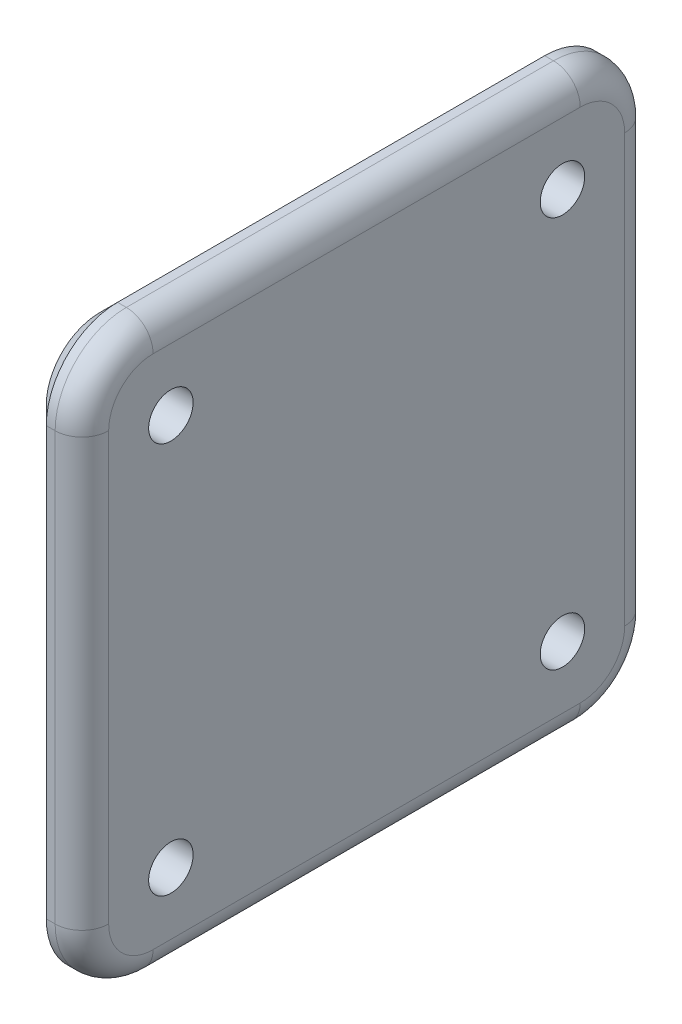
ISO-10303-21;
HEADER;
FILE_DESCRIPTION(('STEP AP214'),'2;1');
FILE_NAME('part.step','',(''),(''),'','','');
FILE_SCHEMA(('AUTOMOTIVE_DESIGN { 1 0 10303 214 1 1 1 1 }'));
ENDSEC;
DATA;
#1=APPLICATION_CONTEXT('core data for automotive mechanical design processes');
#2=APPLICATION_PROTOCOL_DEFINITION('international standard','automotive_design',2000,#1);
#3=PRODUCT_CONTEXT('',#1,'mechanical');
#4=PRODUCT('Part','Part','',(#3));
#5=PRODUCT_RELATED_PRODUCT_CATEGORY('part','',(#4));
#6=PRODUCT_DEFINITION_FORMATION('','',#4);
#7=PRODUCT_DEFINITION_CONTEXT('part definition',#1,'design');
#8=PRODUCT_DEFINITION('design','',#6,#7);
#9=PRODUCT_DEFINITION_SHAPE('','',#8);
#10=(LENGTH_UNIT() NAMED_UNIT(*) SI_UNIT(.MILLI.,.METRE.));
#11=(NAMED_UNIT(*) PLANE_ANGLE_UNIT() SI_UNIT($,.RADIAN.));
#12=(NAMED_UNIT(*) SI_UNIT($,.STERADIAN.) SOLID_ANGLE_UNIT());
#13=UNCERTAINTY_MEASURE_WITH_UNIT(LENGTH_MEASURE(1.E-05),#10,'distance_accuracy_value','');
#14=(GEOMETRIC_REPRESENTATION_CONTEXT(3) GLOBAL_UNCERTAINTY_ASSIGNED_CONTEXT((#13)) GLOBAL_UNIT_ASSIGNED_CONTEXT((#10,
#11,#12)) REPRESENTATION_CONTEXT('',''));
#15=CARTESIAN_POINT('',(0.,0.,0.));
#16=DIRECTION('',(0.,0.,1.));
#17=DIRECTION('',(1.,0.,0.));
#18=AXIS2_PLACEMENT_3D('',#15,#16,#17);
#19=CARTESIAN_POINT('',(9.525,50.8,50.8));
#20=DIRECTION('',(-1.,0.,0.));
#21=DIRECTION('',(0.,0.,1.));
#22=AXIS2_PLACEMENT_3D('',#19,#20,#21);
#23=CYLINDRICAL_SURFACE('',#22,12.7);
#24=DIRECTION('',(-1.,0.,0.));
#25=VECTOR('',#24,1.);
#26=CARTESIAN_POINT('',(9.525,50.8,38.1));
#27=LINE('',#26,#25);
#28=CARTESIAN_POINT('',(4.7498,50.8,38.1));
#29=VERTEX_POINT('',#28);
#30=CARTESIAN_POINT('',(3.175,50.8,38.1));
#31=VERTEX_POINT('',#30);
#32=EDGE_CURVE('E152',#29,#31,#27,.T.);
#33=ORIENTED_EDGE('',*,*,#32,.F.);
#34=CARTESIAN_POINT('',(4.7498,50.8,50.8));
#35=DIRECTION('',(-1.,0.,0.));
#36=DIRECTION('',(0.,0.,1.));
#37=AXIS2_PLACEMENT_3D('',#34,#35,#36);
#38=CIRCLE('',#37,12.7);
#39=CARTESIAN_POINT('',(4.7498,38.1,50.8));
#40=VERTEX_POINT('',#39);
#41=EDGE_CURVE('E11',#29,#40,#38,.T.);
#42=ORIENTED_EDGE('',*,*,#41,.T.);
#43=DIRECTION('',(-1.,0.,0.));
#44=VECTOR('',#43,1.);
#45=CARTESIAN_POINT('',(9.525,38.1,50.8));
#46=LINE('',#45,#44);
#47=CARTESIAN_POINT('',(3.175,38.1,50.8));
#48=VERTEX_POINT('',#47);
#49=EDGE_CURVE('E303',#40,#48,#46,.T.);
#50=ORIENTED_EDGE('',*,*,#49,.T.);
#51=CARTESIAN_POINT('',(3.175,50.8,50.8));
#52=DIRECTION('',(-1.,0.,0.));
#53=DIRECTION('',(0.,0.,1.));
#54=AXIS2_PLACEMENT_3D('',#51,#52,#53);
#55=CIRCLE('',#54,12.7);
#56=EDGE_CURVE('E209',#48,#31,#55,.F.);
#57=ORIENTED_EDGE('',*,*,#56,.T.);
#58=EDGE_LOOP('',(#33,#42,#50,#57));
#59=FACE_BOUND('',#58,.T.);
#60=ADVANCED_FACE('F33',(#59),#23,.T.);
#61=CARTESIAN_POINT('',(9.525,127.,38.1));
#62=DIRECTION('',(0.,0.,1.));
#63=DIRECTION('',(0.,-1.,0.));
#64=AXIS2_PLACEMENT_3D('',#61,#62,#63);
#65=PLANE('',#64);
#66=DIRECTION('',(-1.,0.,0.));
#67=VECTOR('',#66,1.);
#68=CARTESIAN_POINT('',(9.525,127.,38.1));
#69=LINE('',#68,#67);
#70=CARTESIAN_POINT('',(4.7498,127.,38.1));
#71=VERTEX_POINT('',#70);
#72=CARTESIAN_POINT('',(3.175,127.,38.1));
#73=VERTEX_POINT('',#72);
#74=EDGE_CURVE('E144',#71,#73,#69,.T.);
#75=ORIENTED_EDGE('',*,*,#74,.F.);
#76=DIRECTION('',(0.,1.,0.));
#77=VECTOR('',#76,1.);
#78=CARTESIAN_POINT('',(4.7498,127.,38.1));
#79=LINE('',#78,#77);
#80=EDGE_CURVE('E41',#71,#29,#79,.F.);
#81=ORIENTED_EDGE('',*,*,#80,.T.);
#82=ORIENTED_EDGE('',*,*,#32,.T.);
#83=DIRECTION('',(0.,1.,0.));
#84=VECTOR('',#83,1.);
#85=CARTESIAN_POINT('',(3.175,127.,38.1));
#86=LINE('',#85,#84);
#87=EDGE_CURVE('E161',#31,#73,#86,.T.);
#88=ORIENTED_EDGE('',*,*,#87,.T.);
#89=EDGE_LOOP('',(#75,#81,#82,#88));
#90=FACE_BOUND('',#89,.T.);
#91=ADVANCED_FACE('F175',(#90),#65,.F.);
#92=CARTESIAN_POINT('',(9.525,127.,50.8));
#93=DIRECTION('',(-1.,0.,0.));
#94=DIRECTION('',(0.,0.,1.));
#95=AXIS2_PLACEMENT_3D('',#92,#93,#94);
#96=CYLINDRICAL_SURFACE('',#95,12.7);
#97=DIRECTION('',(-1.,0.,0.));
#98=VECTOR('',#97,1.);
#99=CARTESIAN_POINT('',(9.525,139.7,50.8));
#100=LINE('',#99,#98);
#101=CARTESIAN_POINT('',(4.7498,139.7,50.8));
#102=VERTEX_POINT('',#101);
#103=CARTESIAN_POINT('',(3.175,139.7,50.8));
#104=VERTEX_POINT('',#103);
#105=EDGE_CURVE('E153',#102,#104,#100,.T.);
#106=ORIENTED_EDGE('',*,*,#105,.F.);
#107=CARTESIAN_POINT('',(4.7498,127.,50.8));
#108=DIRECTION('',(-1.,0.,0.));
#109=DIRECTION('',(0.,0.,1.));
#110=AXIS2_PLACEMENT_3D('',#107,#108,#109);
#111=CIRCLE('',#110,12.7);
#112=EDGE_CURVE('E56',#102,#71,#111,.T.);
#113=ORIENTED_EDGE('',*,*,#112,.T.);
#114=ORIENTED_EDGE('',*,*,#74,.T.);
#115=CARTESIAN_POINT('',(3.175,127.,50.8));
#116=DIRECTION('',(-1.,0.,0.));
#117=DIRECTION('',(0.,0.,1.));
#118=AXIS2_PLACEMENT_3D('',#115,#116,#117);
#119=CIRCLE('',#118,12.7);
#120=EDGE_CURVE('E148',#73,#104,#119,.F.);
#121=ORIENTED_EDGE('',*,*,#120,.T.);
#122=EDGE_LOOP('',(#106,#113,#114,#121));
#123=FACE_BOUND('',#122,.T.);
#124=ADVANCED_FACE('F146',(#123),#96,.T.);
#125=CARTESIAN_POINT('',(9.525,139.7,127.));
#126=DIRECTION('',(0.,-1.,0.));
#127=DIRECTION('',(0.,0.,-1.));
#128=AXIS2_PLACEMENT_3D('',#125,#126,#127);
#129=PLANE('',#128);
#130=DIRECTION('',(-1.,0.,0.));
#131=VECTOR('',#130,1.);
#132=CARTESIAN_POINT('',(9.525,139.7,127.));
#133=LINE('',#132,#131);
#134=CARTESIAN_POINT('',(4.7498,139.7,127.));
#135=VERTEX_POINT('',#134);
#136=CARTESIAN_POINT('',(3.175,139.7,127.));
#137=VERTEX_POINT('',#136);
#138=EDGE_CURVE('E311',#135,#137,#133,.T.);
#139=ORIENTED_EDGE('',*,*,#138,.F.);
#140=DIRECTION('',(0.,0.,1.));
#141=VECTOR('',#140,1.);
#142=CARTESIAN_POINT('',(4.7498,139.7,127.));
#143=LINE('',#142,#141);
#144=EDGE_CURVE('E237',#135,#102,#143,.F.);
#145=ORIENTED_EDGE('',*,*,#144,.T.);
#146=ORIENTED_EDGE('',*,*,#105,.T.);
#147=DIRECTION('',(0.,0.,1.));
#148=VECTOR('',#147,1.);
#149=CARTESIAN_POINT('',(3.175,139.7,127.));
#150=LINE('',#149,#148);
#151=EDGE_CURVE('E173',#104,#137,#150,.T.);
#152=ORIENTED_EDGE('',*,*,#151,.T.);
#153=EDGE_LOOP('',(#139,#145,#146,#152));
#154=FACE_BOUND('',#153,.T.);
#155=ADVANCED_FACE('F315',(#154),#129,.F.);
#156=CARTESIAN_POINT('',(9.525,127.,127.));
#157=DIRECTION('',(-1.,0.,0.));
#158=DIRECTION('',(0.,0.,1.));
#159=AXIS2_PLACEMENT_3D('',#156,#157,#158);
#160=CYLINDRICAL_SURFACE('',#159,12.7);
#161=DIRECTION('',(-1.,0.,0.));
#162=VECTOR('',#161,1.);
#163=CARTESIAN_POINT('',(9.525,127.,139.7));
#164=LINE('',#163,#162);
#165=CARTESIAN_POINT('',(4.7498,127.,139.7));
#166=VERTEX_POINT('',#165);
#167=CARTESIAN_POINT('',(3.175,127.,139.7));
#168=VERTEX_POINT('',#167);
#169=EDGE_CURVE('E309',#166,#168,#164,.T.);
#170=ORIENTED_EDGE('',*,*,#169,.F.);
#171=CARTESIAN_POINT('',(4.7498,127.,127.));
#172=DIRECTION('',(-1.,0.,0.));
#173=DIRECTION('',(0.,0.,1.));
#174=AXIS2_PLACEMENT_3D('',#171,#172,#173);
#175=CIRCLE('',#174,12.7);
#176=EDGE_CURVE('E235',#166,#135,#175,.T.);
#177=ORIENTED_EDGE('',*,*,#176,.T.);
#178=ORIENTED_EDGE('',*,*,#138,.T.);
#179=CARTESIAN_POINT('',(3.175,127.,127.));
#180=DIRECTION('',(-1.,0.,0.));
#181=DIRECTION('',(0.,0.,1.));
#182=AXIS2_PLACEMENT_3D('',#179,#180,#181);
#183=CIRCLE('',#182,12.7);
#184=EDGE_CURVE('E197',#137,#168,#183,.F.);
#185=ORIENTED_EDGE('',*,*,#184,.T.);
#186=EDGE_LOOP('',(#170,#177,#178,#185));
#187=FACE_BOUND('',#186,.T.);
#188=ADVANCED_FACE('F370',(#187),#160,.T.);
#189=CARTESIAN_POINT('',(9.525,127.,139.7));
#190=DIRECTION('',(0.,0.,-1.));
#191=DIRECTION('',(0.,1.,0.));
#192=AXIS2_PLACEMENT_3D('',#189,#190,#191);
#193=PLANE('',#192);
#194=DIRECTION('',(-1.,0.,0.));
#195=VECTOR('',#194,1.);
#196=CARTESIAN_POINT('',(9.525,50.8,139.7));
#197=LINE('',#196,#195);
#198=CARTESIAN_POINT('',(4.7498,50.8,139.7));
#199=VERTEX_POINT('',#198);
#200=CARTESIAN_POINT('',(3.175,50.8,139.7));
#201=VERTEX_POINT('',#200);
#202=EDGE_CURVE('E307',#199,#201,#197,.T.);
#203=ORIENTED_EDGE('',*,*,#202,.F.);
#204=DIRECTION('',(0.,-1.,0.));
#205=VECTOR('',#204,1.);
#206=CARTESIAN_POINT('',(4.7498,127.,139.7));
#207=LINE('',#206,#205);
#208=EDGE_CURVE('E233',#199,#166,#207,.F.);
#209=ORIENTED_EDGE('',*,*,#208,.T.);
#210=ORIENTED_EDGE('',*,*,#169,.T.);
#211=DIRECTION('',(0.,-1.,0.));
#212=VECTOR('',#211,1.);
#213=CARTESIAN_POINT('',(3.175,50.8,139.7));
#214=LINE('',#213,#212);
#215=EDGE_CURVE('E200',#168,#201,#214,.T.);
#216=ORIENTED_EDGE('',*,*,#215,.T.);
#217=EDGE_LOOP('',(#203,#209,#210,#216));
#218=FACE_BOUND('',#217,.T.);
#219=ADVANCED_FACE('F357',(#218),#193,.F.);
#220=CARTESIAN_POINT('',(9.525,50.8,127.));
#221=DIRECTION('',(-1.,0.,0.));
#222=DIRECTION('',(0.,0.,1.));
#223=AXIS2_PLACEMENT_3D('',#220,#221,#222);
#224=CYLINDRICAL_SURFACE('',#223,12.7);
#225=DIRECTION('',(-1.,0.,0.));
#226=VECTOR('',#225,1.);
#227=CARTESIAN_POINT('',(9.525,38.1,127.));
#228=LINE('',#227,#226);
#229=CARTESIAN_POINT('',(4.7498,38.1,127.));
#230=VERTEX_POINT('',#229);
#231=CARTESIAN_POINT('',(3.175,38.1,127.));
#232=VERTEX_POINT('',#231);
#233=EDGE_CURVE('E305',#230,#232,#228,.T.);
#234=ORIENTED_EDGE('',*,*,#233,.F.);
#235=CARTESIAN_POINT('',(4.7498,50.8,127.));
#236=DIRECTION('',(-1.,0.,0.));
#237=DIRECTION('',(0.,0.,1.));
#238=AXIS2_PLACEMENT_3D('',#235,#236,#237);
#239=CIRCLE('',#238,12.7);
#240=EDGE_CURVE('E231',#230,#199,#239,.T.);
#241=ORIENTED_EDGE('',*,*,#240,.T.);
#242=ORIENTED_EDGE('',*,*,#202,.T.);
#243=CARTESIAN_POINT('',(3.175,50.8,127.));
#244=DIRECTION('',(-1.,0.,0.));
#245=DIRECTION('',(0.,0.,1.));
#246=AXIS2_PLACEMENT_3D('',#243,#244,#245);
#247=CIRCLE('',#246,12.7);
#248=EDGE_CURVE('E203',#201,#232,#247,.F.);
#249=ORIENTED_EDGE('',*,*,#248,.T.);
#250=EDGE_LOOP('',(#234,#241,#242,#249));
#251=FACE_BOUND('',#250,.T.);
#252=ADVANCED_FACE('F354',(#251),#224,.T.);
#253=CARTESIAN_POINT('',(9.525,38.1,127.));
#254=DIRECTION('',(0.,1.,0.));
#255=DIRECTION('',(0.,0.,1.));
#256=AXIS2_PLACEMENT_3D('',#253,#254,#255);
#257=PLANE('',#256);
#258=ORIENTED_EDGE('',*,*,#49,.F.);
#259=DIRECTION('',(0.,0.,-1.));
#260=VECTOR('',#259,1.);
#261=CARTESIAN_POINT('',(4.7498,38.1,127.));
#262=LINE('',#261,#260);
#263=EDGE_CURVE('E228',#40,#230,#262,.F.);
#264=ORIENTED_EDGE('',*,*,#263,.T.);
#265=ORIENTED_EDGE('',*,*,#233,.T.);
#266=DIRECTION('',(0.,0.,-1.));
#267=VECTOR('',#266,1.);
#268=CARTESIAN_POINT('',(3.175,38.1,50.8));
#269=LINE('',#268,#267);
#270=EDGE_CURVE('E206',#232,#48,#269,.T.);
#271=ORIENTED_EDGE('',*,*,#270,.T.);
#272=EDGE_LOOP('',(#258,#264,#265,#271));
#273=FACE_BOUND('',#272,.T.);
#274=ADVANCED_FACE('F339',(#273),#257,.F.);
#275=CARTESIAN_POINT('',(9.525,50.8,50.8));
#276=DIRECTION('',(-1.,0.,0.));
#277=DIRECTION('',(0.,0.,1.));
#278=AXIS2_PLACEMENT_3D('',#275,#276,#277);
#279=PLANE('',#278);
#280=CARTESIAN_POINT('',(9.525,53.975,123.825));
#281=DIRECTION('',(1.,0.,0.));
#282=DIRECTION('',(0.,0.,-1.));
#283=AXIS2_PLACEMENT_3D('',#280,#281,#282);
#284=CIRCLE('',#283,3.96874999999999);
#285=CARTESIAN_POINT('',(9.525,53.975,119.85625));
#286=VERTEX_POINT('',#285);
#287=EDGE_CURVE('E261',#286,#286,#284,.T.);
#288=ORIENTED_EDGE('',*,*,#287,.F.);
#289=EDGE_LOOP('',(#288));
#290=FACE_BOUND('',#289,.T.);
#291=CARTESIAN_POINT('',(9.525,123.825,123.825));
#292=DIRECTION('',(1.,0.,0.));
#293=DIRECTION('',(0.,0.,-1.));
#294=AXIS2_PLACEMENT_3D('',#291,#292,#293);
#295=CIRCLE('',#294,3.96874999999999);
#296=CARTESIAN_POINT('',(9.525,123.825,119.85625));
#297=VERTEX_POINT('',#296);
#298=EDGE_CURVE('E251',#297,#297,#295,.T.);
#299=ORIENTED_EDGE('',*,*,#298,.F.);
#300=EDGE_LOOP('',(#299));
#301=FACE_BOUND('',#300,.T.);
#302=CARTESIAN_POINT('',(9.525,123.825,53.975));
#303=DIRECTION('',(1.,0.,0.));
#304=DIRECTION('',(0.,0.,-1.));
#305=AXIS2_PLACEMENT_3D('',#302,#303,#304);
#306=CIRCLE('',#305,3.96875);
#307=CARTESIAN_POINT('',(9.525,123.825,50.00625));
#308=VERTEX_POINT('',#307);
#309=EDGE_CURVE('E248',#308,#308,#306,.T.);
#310=ORIENTED_EDGE('',*,*,#309,.F.);
#311=EDGE_LOOP('',(#310));
#312=FACE_BOUND('',#311,.T.);
#313=CARTESIAN_POINT('',(9.525,53.975,53.975));
#314=DIRECTION('',(1.,0.,0.));
#315=DIRECTION('',(0.,0.,-1.));
#316=AXIS2_PLACEMENT_3D('',#313,#314,#315);
#317=CIRCLE('',#316,3.96875);
#318=CARTESIAN_POINT('',(9.525,53.975,50.00625));
#319=VERTEX_POINT('',#318);
#320=EDGE_CURVE('E245',#319,#319,#317,.T.);
#321=ORIENTED_EDGE('',*,*,#320,.F.);
#322=EDGE_LOOP('',(#321));
#323=FACE_BOUND('',#322,.T.);
#324=CARTESIAN_POINT('',(9.525,50.8,127.));
#325=DIRECTION('',(-1.,0.,0.));
#326=DIRECTION('',(0.,0.,1.));
#327=AXIS2_PLACEMENT_3D('',#324,#325,#326);
#328=CIRCLE('',#327,7.92479999999998);
#329=CARTESIAN_POINT('',(9.525,50.8,134.9248));
#330=VERTEX_POINT('',#329);
#331=CARTESIAN_POINT('',(9.525,42.8752,127.));
#332=VERTEX_POINT('',#331);
#333=EDGE_CURVE('E223',#330,#332,#328,.F.);
#334=ORIENTED_EDGE('',*,*,#333,.T.);
#335=DIRECTION('',(0.,0.,-1.));
#336=VECTOR('',#335,1.);
#337=CARTESIAN_POINT('',(9.525,42.8752,50.8));
#338=LINE('',#337,#336);
#339=CARTESIAN_POINT('',(9.525,42.8752,50.8));
#340=VERTEX_POINT('',#339);
#341=EDGE_CURVE('E225',#332,#340,#338,.T.);
#342=ORIENTED_EDGE('',*,*,#341,.T.);
#343=CARTESIAN_POINT('',(9.525,50.8,50.8));
#344=DIRECTION('',(-1.,0.,0.));
#345=DIRECTION('',(0.,0.,1.));
#346=AXIS2_PLACEMENT_3D('',#343,#344,#345);
#347=CIRCLE('',#346,7.92480000000001);
#348=CARTESIAN_POINT('',(9.525,50.8,42.8752));
#349=VERTEX_POINT('',#348);
#350=EDGE_CURVE('E211',#340,#349,#347,.F.);
#351=ORIENTED_EDGE('',*,*,#350,.T.);
#352=DIRECTION('',(0.,1.,0.));
#353=VECTOR('',#352,1.);
#354=CARTESIAN_POINT('',(9.525,50.8,42.8752));
#355=LINE('',#354,#353);
#356=CARTESIAN_POINT('',(9.525,127.,42.8752));
#357=VERTEX_POINT('',#356);
#358=EDGE_CURVE('E213',#349,#357,#355,.T.);
#359=ORIENTED_EDGE('',*,*,#358,.T.);
#360=CARTESIAN_POINT('',(9.525,127.,50.8));
#361=DIRECTION('',(-1.,0.,0.));
#362=DIRECTION('',(0.,0.,1.));
#363=AXIS2_PLACEMENT_3D('',#360,#361,#362);
#364=CIRCLE('',#363,7.92480000000001);
#365=CARTESIAN_POINT('',(9.525,134.9248,50.8));
#366=VERTEX_POINT('',#365);
#367=EDGE_CURVE('E215',#357,#366,#364,.F.);
#368=ORIENTED_EDGE('',*,*,#367,.T.);
#369=DIRECTION('',(0.,0.,1.));
#370=VECTOR('',#369,1.);
#371=CARTESIAN_POINT('',(9.525,134.9248,50.8));
#372=LINE('',#371,#370);
#373=CARTESIAN_POINT('',(9.525,134.9248,127.));
#374=VERTEX_POINT('',#373);
#375=EDGE_CURVE('E217',#366,#374,#372,.T.);
#376=ORIENTED_EDGE('',*,*,#375,.T.);
#377=CARTESIAN_POINT('',(9.525,127.,127.));
#378=DIRECTION('',(-1.,0.,0.));
#379=DIRECTION('',(0.,0.,1.));
#380=AXIS2_PLACEMENT_3D('',#377,#378,#379);
#381=CIRCLE('',#380,7.92479999999997);
#382=CARTESIAN_POINT('',(9.525,127.,134.9248));
#383=VERTEX_POINT('',#382);
#384=EDGE_CURVE('E219',#374,#383,#381,.F.);
#385=ORIENTED_EDGE('',*,*,#384,.T.);
#386=DIRECTION('',(0.,-1.,0.));
#387=VECTOR('',#386,1.);
#388=CARTESIAN_POINT('',(9.525,50.8,134.9248));
#389=LINE('',#388,#387);
#390=EDGE_CURVE('E221',#383,#330,#389,.T.);
#391=ORIENTED_EDGE('',*,*,#390,.T.);
#392=EDGE_LOOP('',(#334,#342,#351,#359,#368,#376,#385,#391));
#393=FACE_BOUND('',#392,.T.);
#394=ADVANCED_FACE('F424',(#290,#301,#312,#323,#393),#279,.F.);
#395=CARTESIAN_POINT('',(0.,50.8,50.8));
#396=DIRECTION('',(-1.,0.,0.));
#397=DIRECTION('',(0.,0.,1.));
#398=AXIS2_PLACEMENT_3D('',#395,#396,#397);
#399=PLANE('',#398);
#400=CARTESIAN_POINT('',(0.,53.975,123.825));
#401=DIRECTION('',(-1.,0.,0.));
#402=DIRECTION('',(0.,0.,1.));
#403=AXIS2_PLACEMENT_3D('',#400,#401,#402);
#404=CIRCLE('',#403,3.96874999999999);
#405=CARTESIAN_POINT('',(0.,53.975,127.79375));
#406=VERTEX_POINT('',#405);
#407=EDGE_CURVE('E36',#406,#406,#404,.T.);
#408=ORIENTED_EDGE('',*,*,#407,.F.);
#409=EDGE_LOOP('',(#408));
#410=FACE_BOUND('',#409,.T.);
#411=CARTESIAN_POINT('',(0.,123.825,123.825));
#412=DIRECTION('',(-1.,0.,0.));
#413=DIRECTION('',(0.,0.,1.));
#414=AXIS2_PLACEMENT_3D('',#411,#412,#413);
#415=CIRCLE('',#414,3.96874999999999);
#416=CARTESIAN_POINT('',(0.,123.825,127.79375));
#417=VERTEX_POINT('',#416);
#418=EDGE_CURVE('E249',#417,#417,#415,.T.);
#419=ORIENTED_EDGE('',*,*,#418,.F.);
#420=EDGE_LOOP('',(#419));
#421=FACE_BOUND('',#420,.T.);
#422=CARTESIAN_POINT('',(0.,123.825,53.975));
#423=DIRECTION('',(-1.,0.,0.));
#424=DIRECTION('',(0.,0.,1.));
#425=AXIS2_PLACEMENT_3D('',#422,#423,#424);
#426=CIRCLE('',#425,3.96875);
#427=CARTESIAN_POINT('',(0.,123.825,57.94375));
#428=VERTEX_POINT('',#427);
#429=EDGE_CURVE('E246',#428,#428,#426,.T.);
#430=ORIENTED_EDGE('',*,*,#429,.F.);
#431=EDGE_LOOP('',(#430));
#432=FACE_BOUND('',#431,.T.);
#433=CARTESIAN_POINT('',(0.,53.975,53.975));
#434=DIRECTION('',(-1.,0.,0.));
#435=DIRECTION('',(0.,0.,1.));
#436=AXIS2_PLACEMENT_3D('',#433,#434,#435);
#437=CIRCLE('',#436,3.96875);
#438=CARTESIAN_POINT('',(0.,53.975,57.94375));
#439=VERTEX_POINT('',#438);
#440=EDGE_CURVE('E241',#439,#439,#437,.T.);
#441=ORIENTED_EDGE('',*,*,#440,.F.);
#442=EDGE_LOOP('',(#441));
#443=FACE_BOUND('',#442,.T.);
#444=CARTESIAN_POINT('',(0.,127.,50.8));
#445=DIRECTION('',(-1.,0.,0.));
#446=DIRECTION('',(0.,0.,1.));
#447=AXIS2_PLACEMENT_3D('',#444,#445,#446);
#448=CIRCLE('',#447,9.52500000000001);
#449=CARTESIAN_POINT('',(0.,136.525,50.8));
#450=VERTEX_POINT('',#449);
#451=CARTESIAN_POINT('',(0.,127.,41.275));
#452=VERTEX_POINT('',#451);
#453=EDGE_CURVE('E192',#450,#452,#448,.T.);
#454=ORIENTED_EDGE('',*,*,#453,.T.);
#455=DIRECTION('',(0.,-1.,0.));
#456=VECTOR('',#455,1.);
#457=CARTESIAN_POINT('',(0.,50.8,41.275));
#458=LINE('',#457,#456);
#459=CARTESIAN_POINT('',(0.,50.8,41.275));
#460=VERTEX_POINT('',#459);
#461=EDGE_CURVE('E163',#452,#460,#458,.T.);
#462=ORIENTED_EDGE('',*,*,#461,.T.);
#463=CARTESIAN_POINT('',(0.,50.8,50.8));
#464=DIRECTION('',(-1.,0.,0.));
#465=DIRECTION('',(0.,0.,1.));
#466=AXIS2_PLACEMENT_3D('',#463,#464,#465);
#467=CIRCLE('',#466,9.525);
#468=CARTESIAN_POINT('',(0.,41.275,50.8));
#469=VERTEX_POINT('',#468);
#470=EDGE_CURVE('E177',#460,#469,#467,.T.);
#471=ORIENTED_EDGE('',*,*,#470,.T.);
#472=DIRECTION('',(0.,0.,1.));
#473=VECTOR('',#472,1.);
#474=CARTESIAN_POINT('',(0.,41.275,127.));
#475=LINE('',#474,#473);
#476=CARTESIAN_POINT('',(0.,41.275,127.));
#477=VERTEX_POINT('',#476);
#478=EDGE_CURVE('E179',#469,#477,#475,.T.);
#479=ORIENTED_EDGE('',*,*,#478,.T.);
#480=CARTESIAN_POINT('',(0.,50.8,127.));
#481=DIRECTION('',(-1.,0.,0.));
#482=DIRECTION('',(0.,0.,1.));
#483=AXIS2_PLACEMENT_3D('',#480,#481,#482);
#484=CIRCLE('',#483,9.52499999999998);
#485=CARTESIAN_POINT('',(0.,50.8,136.525));
#486=VERTEX_POINT('',#485);
#487=EDGE_CURVE('E184',#477,#486,#484,.T.);
#488=ORIENTED_EDGE('',*,*,#487,.T.);
#489=DIRECTION('',(0.,1.,0.));
#490=VECTOR('',#489,1.);
#491=CARTESIAN_POINT('',(0.,127.,136.525));
#492=LINE('',#491,#490);
#493=CARTESIAN_POINT('',(0.,127.,136.525));
#494=VERTEX_POINT('',#493);
#495=EDGE_CURVE('E186',#486,#494,#492,.T.);
#496=ORIENTED_EDGE('',*,*,#495,.T.);
#497=CARTESIAN_POINT('',(0.,127.,127.));
#498=DIRECTION('',(-1.,0.,0.));
#499=DIRECTION('',(0.,0.,1.));
#500=AXIS2_PLACEMENT_3D('',#497,#498,#499);
#501=CIRCLE('',#500,9.52499999999998);
#502=CARTESIAN_POINT('',(0.,136.525,127.));
#503=VERTEX_POINT('',#502);
#504=EDGE_CURVE('E188',#494,#503,#501,.T.);
#505=ORIENTED_EDGE('',*,*,#504,.T.);
#506=DIRECTION('',(0.,0.,-1.));
#507=VECTOR('',#506,1.);
#508=CARTESIAN_POINT('',(0.,136.525,50.8));
#509=LINE('',#508,#507);
#510=EDGE_CURVE('E190',#503,#450,#509,.T.);
#511=ORIENTED_EDGE('',*,*,#510,.T.);
#512=EDGE_LOOP('',(#454,#462,#471,#479,#488,#496,#505,#511));
#513=FACE_BOUND('',#512,.T.);
#514=ADVANCED_FACE('F382',(#410,#421,#432,#443,#513),#399,.T.);
#515=CARTESIAN_POINT('',(3.175,127.,139.7));
#516=DIRECTION('',(-0.707106781186549,0.,0.707106781186546));
#517=DIRECTION('',(0.707106781186546,0.,0.707106781186549));
#518=AXIS2_PLACEMENT_3D('',#515,#516,#517);
#519=PLANE('',#518);
#520=DIRECTION('',(0.707106781186546,0.,0.707106781186549));
#521=VECTOR('',#520,1.);
#522=CARTESIAN_POINT('',(0.,127.,136.525));
#523=LINE('',#522,#521);
#524=EDGE_CURVE('E297',#494,#168,#523,.T.);
#525=ORIENTED_EDGE('',*,*,#524,.F.);
#526=ORIENTED_EDGE('',*,*,#495,.F.);
#527=DIRECTION('',(-0.707106781186546,0.,-0.707106781186549));
#528=VECTOR('',#527,1.);
#529=CARTESIAN_POINT('',(3.175,50.8,139.7));
#530=LINE('',#529,#528);
#531=EDGE_CURVE('E300',#201,#486,#530,.T.);
#532=ORIENTED_EDGE('',*,*,#531,.F.);
#533=ORIENTED_EDGE('',*,*,#215,.F.);
#534=EDGE_LOOP('',(#525,#526,#532,#533));
#535=FACE_BOUND('',#534,.T.);
#536=ADVANCED_FACE('F375',(#535),#519,.T.);
#537=CARTESIAN_POINT('',(3.175,50.8,127.));
#538=DIRECTION('',(1.,0.,0.));
#539=DIRECTION('',(0.,0.,-1.));
#540=AXIS2_PLACEMENT_3D('',#537,#538,#539);
#541=CONICAL_SURFACE('',#540,12.7,0.78539816339745);
#542=ORIENTED_EDGE('',*,*,#531,.T.);
#543=ORIENTED_EDGE('',*,*,#487,.F.);
#544=DIRECTION('',(-0.707106781186547,0.707106781186549,0.));
#545=VECTOR('',#544,1.);
#546=CARTESIAN_POINT('',(3.175,38.1,127.));
#547=LINE('',#546,#545);
#548=EDGE_CURVE('E294',#232,#477,#547,.T.);
#549=ORIENTED_EDGE('',*,*,#548,.F.);
#550=ORIENTED_EDGE('',*,*,#248,.F.);
#551=EDGE_LOOP('',(#542,#543,#549,#550));
#552=FACE_BOUND('',#551,.T.);
#553=ADVANCED_FACE('F385',(#552),#541,.T.);
#554=CARTESIAN_POINT('',(3.175,127.,127.));
#555=DIRECTION('',(1.,0.,0.));
#556=DIRECTION('',(0.,0.,-1.));
#557=AXIS2_PLACEMENT_3D('',#554,#555,#556);
#558=CONICAL_SURFACE('',#557,12.7,0.785398163397449);
#559=ORIENTED_EDGE('',*,*,#524,.T.);
#560=ORIENTED_EDGE('',*,*,#184,.F.);
#561=DIRECTION('',(0.707106781186549,0.707106781186546,0.));
#562=VECTOR('',#561,1.);
#563=CARTESIAN_POINT('',(0.,136.525,127.));
#564=LINE('',#563,#562);
#565=EDGE_CURVE('E291',#503,#137,#564,.T.);
#566=ORIENTED_EDGE('',*,*,#565,.F.);
#567=ORIENTED_EDGE('',*,*,#504,.F.);
#568=EDGE_LOOP('',(#559,#560,#566,#567));
#569=FACE_BOUND('',#568,.T.);
#570=ADVANCED_FACE('F379',(#569),#558,.T.);
#571=CARTESIAN_POINT('',(3.175,38.1,127.));
#572=DIRECTION('',(-0.707106781186549,-0.707106781186547,0.));
#573=DIRECTION('',(0.707106781186547,-0.707106781186549,0.));
#574=AXIS2_PLACEMENT_3D('',#571,#572,#573);
#575=PLANE('',#574);
#576=ORIENTED_EDGE('',*,*,#548,.T.);
#577=ORIENTED_EDGE('',*,*,#478,.F.);
#578=DIRECTION('',(-0.707106781186547,0.707106781186549,0.));
#579=VECTOR('',#578,1.);
#580=CARTESIAN_POINT('',(3.175,38.1,50.8));
#581=LINE('',#580,#579);
#582=EDGE_CURVE('E288',#48,#469,#581,.T.);
#583=ORIENTED_EDGE('',*,*,#582,.F.);
#584=ORIENTED_EDGE('',*,*,#270,.F.);
#585=EDGE_LOOP('',(#576,#577,#583,#584));
#586=FACE_BOUND('',#585,.T.);
#587=ADVANCED_FACE('F389',(#586),#575,.T.);
#588=CARTESIAN_POINT('',(3.175,139.7,127.));
#589=DIRECTION('',(-0.707106781186549,0.707106781186546,0.));
#590=DIRECTION('',(-0.707106781186546,-0.707106781186549,0.));
#591=AXIS2_PLACEMENT_3D('',#588,#589,#590);
#592=PLANE('',#591);
#593=ORIENTED_EDGE('',*,*,#565,.T.);
#594=ORIENTED_EDGE('',*,*,#151,.F.);
#595=DIRECTION('',(0.707106781186546,0.707106781186549,0.));
#596=VECTOR('',#595,1.);
#597=CARTESIAN_POINT('',(0.,136.525,50.8));
#598=LINE('',#597,#596);
#599=EDGE_CURVE('E172',#450,#104,#598,.T.);
#600=ORIENTED_EDGE('',*,*,#599,.F.);
#601=ORIENTED_EDGE('',*,*,#510,.F.);
#602=EDGE_LOOP('',(#593,#594,#600,#601));
#603=FACE_BOUND('',#602,.T.);
#604=ADVANCED_FACE('F396',(#603),#592,.T.);
#605=CARTESIAN_POINT('',(3.175,50.8,50.8));
#606=DIRECTION('',(1.,0.,0.));
#607=DIRECTION('',(0.,0.,-1.));
#608=AXIS2_PLACEMENT_3D('',#605,#606,#607);
#609=CONICAL_SURFACE('',#608,12.7,0.78539816339745);
#610=ORIENTED_EDGE('',*,*,#582,.T.);
#611=ORIENTED_EDGE('',*,*,#470,.F.);
#612=DIRECTION('',(-0.707106781186546,0.,0.707106781186549));
#613=VECTOR('',#612,1.);
#614=CARTESIAN_POINT('',(3.175,50.8,38.1));
#615=LINE('',#614,#613);
#616=EDGE_CURVE('E166',#31,#460,#615,.T.);
#617=ORIENTED_EDGE('',*,*,#616,.F.);
#618=ORIENTED_EDGE('',*,*,#56,.F.);
#619=EDGE_LOOP('',(#610,#611,#617,#618));
#620=FACE_BOUND('',#619,.T.);
#621=ADVANCED_FACE('F394',(#620),#609,.T.);
#622=CARTESIAN_POINT('',(3.175,127.,50.8));
#623=DIRECTION('',(1.,0.,0.));
#624=DIRECTION('',(0.,0.,-1.));
#625=AXIS2_PLACEMENT_3D('',#622,#623,#624);
#626=CONICAL_SURFACE('',#625,12.7,0.78539816339745);
#627=ORIENTED_EDGE('',*,*,#599,.T.);
#628=ORIENTED_EDGE('',*,*,#120,.F.);
#629=DIRECTION('',(0.707106781186546,0.,-0.707106781186549));
#630=VECTOR('',#629,1.);
#631=CARTESIAN_POINT('',(0.,127.,41.275));
#632=LINE('',#631,#630);
#633=EDGE_CURVE('E159',#452,#73,#632,.T.);
#634=ORIENTED_EDGE('',*,*,#633,.F.);
#635=ORIENTED_EDGE('',*,*,#453,.F.);
#636=EDGE_LOOP('',(#627,#628,#634,#635));
#637=FACE_BOUND('',#636,.T.);
#638=ADVANCED_FACE('F170',(#637),#626,.T.);
#639=CARTESIAN_POINT('',(3.175,127.,38.1));
#640=DIRECTION('',(-0.707106781186549,0.,-0.707106781186547));
#641=DIRECTION('',(-0.707106781186547,0.,0.707106781186549));
#642=AXIS2_PLACEMENT_3D('',#639,#640,#641);
#643=PLANE('',#642);
#644=ORIENTED_EDGE('',*,*,#616,.T.);
#645=ORIENTED_EDGE('',*,*,#461,.F.);
#646=ORIENTED_EDGE('',*,*,#633,.T.);
#647=ORIENTED_EDGE('',*,*,#87,.F.);
#648=EDGE_LOOP('',(#644,#645,#646,#647));
#649=FACE_BOUND('',#648,.T.);
#650=ADVANCED_FACE('F160',(#649),#643,.T.);
#651=CARTESIAN_POINT('',(4.7498,134.9248,50.8));
#652=DIRECTION('',(0.,0.,1.));
#653=DIRECTION('',(0.,-1.,0.));
#654=AXIS2_PLACEMENT_3D('',#651,#652,#653);
#655=CYLINDRICAL_SURFACE('',#654,4.7752);
#656=CARTESIAN_POINT('',(4.7498,134.9248,50.8));
#657=DIRECTION('',(0.,0.,-1.));
#658=DIRECTION('',(-1.,0.,0.));
#659=AXIS2_PLACEMENT_3D('',#656,#657,#658);
#660=CIRCLE('',#659,4.7752);
#661=EDGE_CURVE('E281',#102,#366,#660,.T.);
#662=ORIENTED_EDGE('',*,*,#661,.F.);
#663=ORIENTED_EDGE('',*,*,#144,.F.);
#664=CARTESIAN_POINT('',(4.7498,134.9248,127.));
#665=DIRECTION('',(0.,0.,1.));
#666=DIRECTION('',(1.,0.,0.));
#667=AXIS2_PLACEMENT_3D('',#664,#665,#666);
#668=CIRCLE('',#667,4.7752);
#669=EDGE_CURVE('E167',#374,#135,#668,.T.);
#670=ORIENTED_EDGE('',*,*,#669,.F.);
#671=ORIENTED_EDGE('',*,*,#375,.F.);
#672=EDGE_LOOP('',(#662,#663,#670,#671));
#673=FACE_BOUND('',#672,.T.);
#674=ADVANCED_FACE('F321',(#673),#655,.T.);
#675=CARTESIAN_POINT('',(4.7498,127.,127.));
#676=DIRECTION('',(-1.,0.,0.));
#677=DIRECTION('',(0.,0.,1.));
#678=AXIS2_PLACEMENT_3D('',#675,#676,#677);
#679=TOROIDAL_SURFACE('',#678,7.92479999999997,4.7752);
#680=ORIENTED_EDGE('',*,*,#669,.T.);
#681=ORIENTED_EDGE('',*,*,#176,.F.);
#682=CARTESIAN_POINT('',(4.7498,127.,134.9248));
#683=DIRECTION('',(0.,-1.,0.));
#684=DIRECTION('',(0.,0.,-1.));
#685=AXIS2_PLACEMENT_3D('',#682,#683,#684);
#686=CIRCLE('',#685,4.7752);
#687=EDGE_CURVE('E278',#383,#166,#686,.T.);
#688=ORIENTED_EDGE('',*,*,#687,.F.);
#689=ORIENTED_EDGE('',*,*,#384,.F.);
#690=EDGE_LOOP('',(#680,#681,#688,#689));
#691=FACE_BOUND('',#690,.T.);
#692=ADVANCED_FACE('F368',(#691),#679,.T.);
#693=CARTESIAN_POINT('',(4.7498,127.,50.8));
#694=DIRECTION('',(-1.,0.,0.));
#695=DIRECTION('',(0.,0.,1.));
#696=AXIS2_PLACEMENT_3D('',#693,#694,#695);
#697=TOROIDAL_SURFACE('',#696,7.92480000000001,4.7752);
#698=ORIENTED_EDGE('',*,*,#661,.T.);
#699=ORIENTED_EDGE('',*,*,#367,.F.);
#700=CARTESIAN_POINT('',(4.7498,127.,42.8752));
#701=DIRECTION('',(0.,-1.,0.));
#702=DIRECTION('',(0.,0.,-1.));
#703=AXIS2_PLACEMENT_3D('',#700,#701,#702);
#704=CIRCLE('',#703,4.7752);
#705=EDGE_CURVE('E275',#71,#357,#704,.T.);
#706=ORIENTED_EDGE('',*,*,#705,.F.);
#707=ORIENTED_EDGE('',*,*,#112,.F.);
#708=EDGE_LOOP('',(#698,#699,#706,#707));
#709=FACE_BOUND('',#708,.T.);
#710=ADVANCED_FACE('F325',(#709),#697,.T.);
#711=CARTESIAN_POINT('',(4.7498,50.8,134.9248));
#712=DIRECTION('',(0.,-1.,0.));
#713=DIRECTION('',(0.,0.,-1.));
#714=AXIS2_PLACEMENT_3D('',#711,#712,#713);
#715=CYLINDRICAL_SURFACE('',#714,4.7752);
#716=ORIENTED_EDGE('',*,*,#687,.T.);
#717=ORIENTED_EDGE('',*,*,#208,.F.);
#718=CARTESIAN_POINT('',(4.7498,50.8,134.9248));
#719=DIRECTION('',(0.,-1.,0.));
#720=DIRECTION('',(0.,0.,-1.));
#721=AXIS2_PLACEMENT_3D('',#718,#719,#720);
#722=CIRCLE('',#721,4.7752);
#723=EDGE_CURVE('E272',#330,#199,#722,.T.);
#724=ORIENTED_EDGE('',*,*,#723,.F.);
#725=ORIENTED_EDGE('',*,*,#390,.F.);
#726=EDGE_LOOP('',(#716,#717,#724,#725));
#727=FACE_BOUND('',#726,.T.);
#728=ADVANCED_FACE('F362',(#727),#715,.T.);
#729=CARTESIAN_POINT('',(4.7498,50.8,42.8752));
#730=DIRECTION('',(0.,1.,0.));
#731=DIRECTION('',(0.,0.,1.));
#732=AXIS2_PLACEMENT_3D('',#729,#730,#731);
#733=CYLINDRICAL_SURFACE('',#732,4.7752);
#734=ORIENTED_EDGE('',*,*,#705,.T.);
#735=ORIENTED_EDGE('',*,*,#358,.F.);
#736=CARTESIAN_POINT('',(4.7498,50.8,42.8752));
#737=DIRECTION('',(0.,-1.,0.));
#738=DIRECTION('',(0.,0.,-1.));
#739=AXIS2_PLACEMENT_3D('',#736,#737,#738);
#740=CIRCLE('',#739,4.7752);
#741=EDGE_CURVE('E269',#29,#349,#740,.T.);
#742=ORIENTED_EDGE('',*,*,#741,.F.);
#743=ORIENTED_EDGE('',*,*,#80,.F.);
#744=EDGE_LOOP('',(#734,#735,#742,#743));
#745=FACE_BOUND('',#744,.T.);
#746=ADVANCED_FACE('F329',(#745),#733,.T.);
#747=CARTESIAN_POINT('',(4.7498,50.8,127.));
#748=DIRECTION('',(-1.,0.,0.));
#749=DIRECTION('',(0.,0.,1.));
#750=AXIS2_PLACEMENT_3D('',#747,#748,#749);
#751=TOROIDAL_SURFACE('',#750,7.92479999999998,4.7752);
#752=ORIENTED_EDGE('',*,*,#723,.T.);
#753=ORIENTED_EDGE('',*,*,#240,.F.);
#754=CARTESIAN_POINT('',(4.7498,42.8752,127.));
#755=DIRECTION('',(0.,0.,-1.));
#756=DIRECTION('',(-1.,0.,0.));
#757=AXIS2_PLACEMENT_3D('',#754,#755,#756);
#758=CIRCLE('',#757,4.7752);
#759=EDGE_CURVE('E267',#332,#230,#758,.T.);
#760=ORIENTED_EDGE('',*,*,#759,.F.);
#761=ORIENTED_EDGE('',*,*,#333,.F.);
#762=EDGE_LOOP('',(#752,#753,#760,#761));
#763=FACE_BOUND('',#762,.T.);
#764=ADVANCED_FACE('F350',(#763),#751,.T.);
#765=CARTESIAN_POINT('',(4.7498,50.8,50.8));
#766=DIRECTION('',(-1.,0.,0.));
#767=DIRECTION('',(0.,0.,1.));
#768=AXIS2_PLACEMENT_3D('',#765,#766,#767);
#769=TOROIDAL_SURFACE('',#768,7.92480000000001,4.7752);
#770=ORIENTED_EDGE('',*,*,#741,.T.);
#771=ORIENTED_EDGE('',*,*,#350,.F.);
#772=CARTESIAN_POINT('',(4.7498,42.8752,50.8));
#773=DIRECTION('',(0.,0.,1.));
#774=DIRECTION('',(1.,0.,0.));
#775=AXIS2_PLACEMENT_3D('',#772,#773,#774);
#776=CIRCLE('',#775,4.7752);
#777=EDGE_CURVE('E244',#40,#340,#776,.T.);
#778=ORIENTED_EDGE('',*,*,#777,.F.);
#779=ORIENTED_EDGE('',*,*,#41,.F.);
#780=EDGE_LOOP('',(#770,#771,#778,#779));
#781=FACE_BOUND('',#780,.T.);
#782=ADVANCED_FACE('F334',(#781),#769,.T.);
#783=CARTESIAN_POINT('',(4.7498,42.8752,50.8));
#784=DIRECTION('',(0.,0.,-1.));
#785=DIRECTION('',(0.,1.,0.));
#786=AXIS2_PLACEMENT_3D('',#783,#784,#785);
#787=CYLINDRICAL_SURFACE('',#786,4.7752);
#788=ORIENTED_EDGE('',*,*,#759,.T.);
#789=ORIENTED_EDGE('',*,*,#263,.F.);
#790=ORIENTED_EDGE('',*,*,#777,.T.);
#791=ORIENTED_EDGE('',*,*,#341,.F.);
#792=EDGE_LOOP('',(#788,#789,#790,#791));
#793=FACE_BOUND('',#792,.T.);
#794=ADVANCED_FACE('F344',(#793),#787,.T.);
#795=CARTESIAN_POINT('',(-15.875,53.975,53.975));
#796=DIRECTION('',(1.,0.,0.));
#797=DIRECTION('',(0.,0.,-1.));
#798=AXIS2_PLACEMENT_3D('',#795,#796,#797);
#799=CYLINDRICAL_SURFACE('',#798,3.96875);
#800=ORIENTED_EDGE('',*,*,#440,.T.);
#801=EDGE_LOOP('',(#800));
#802=FACE_BOUND('',#801,.T.);
#803=ORIENTED_EDGE('',*,*,#320,.T.);
#804=EDGE_LOOP('',(#803));
#805=FACE_BOUND('',#804,.T.);
#806=ADVANCED_FACE('F574',(#802,#805),#799,.F.);
#807=CARTESIAN_POINT('',(-15.875,123.825,53.975));
#808=DIRECTION('',(1.,0.,0.));
#809=DIRECTION('',(0.,0.,-1.));
#810=AXIS2_PLACEMENT_3D('',#807,#808,#809);
#811=CYLINDRICAL_SURFACE('',#810,3.96875);
#812=ORIENTED_EDGE('',*,*,#429,.T.);
#813=EDGE_LOOP('',(#812));
#814=FACE_BOUND('',#813,.T.);
#815=ORIENTED_EDGE('',*,*,#309,.T.);
#816=EDGE_LOOP('',(#815));
#817=FACE_BOUND('',#816,.T.);
#818=ADVANCED_FACE('F595',(#814,#817),#811,.F.);
#819=CARTESIAN_POINT('',(-15.875,123.825,123.825));
#820=DIRECTION('',(1.,0.,0.));
#821=DIRECTION('',(0.,0.,-1.));
#822=AXIS2_PLACEMENT_3D('',#819,#820,#821);
#823=CYLINDRICAL_SURFACE('',#822,3.96874999999999);
#824=ORIENTED_EDGE('',*,*,#418,.T.);
#825=EDGE_LOOP('',(#824));
#826=FACE_BOUND('',#825,.T.);
#827=ORIENTED_EDGE('',*,*,#298,.T.);
#828=EDGE_LOOP('',(#827));
#829=FACE_BOUND('',#828,.T.);
#830=ADVANCED_FACE('F605',(#826,#829),#823,.F.);
#831=CARTESIAN_POINT('',(-15.875,53.975,123.825));
#832=DIRECTION('',(1.,0.,0.));
#833=DIRECTION('',(0.,0.,-1.));
#834=AXIS2_PLACEMENT_3D('',#831,#832,#833);
#835=CYLINDRICAL_SURFACE('',#834,3.96874999999999);
#836=ORIENTED_EDGE('',*,*,#407,.T.);
#837=EDGE_LOOP('',(#836));
#838=FACE_BOUND('',#837,.T.);
#839=ORIENTED_EDGE('',*,*,#287,.T.);
#840=EDGE_LOOP('',(#839));
#841=FACE_BOUND('',#840,.T.);
#842=ADVANCED_FACE('F615',(#838,#841),#835,.F.);
#843=CLOSED_SHELL('',(#60,#91,#124,#155,#188,#219,#252,#274,#394,#514,#536,#553,#570,#587,#604,
#621,#638,#650,#674,#692,#710,#728,#746,#764,#782,#794,#806,#818,#830,#842));
#844=MANIFOLD_SOLID_BREP('B2',#843);
#845=ADVANCED_BREP_SHAPE_REPRESENTATION('',(#18,#844),#14);
#846=SHAPE_DEFINITION_REPRESENTATION(#9,#845);
ENDSEC;
END-ISO-10303-21;
